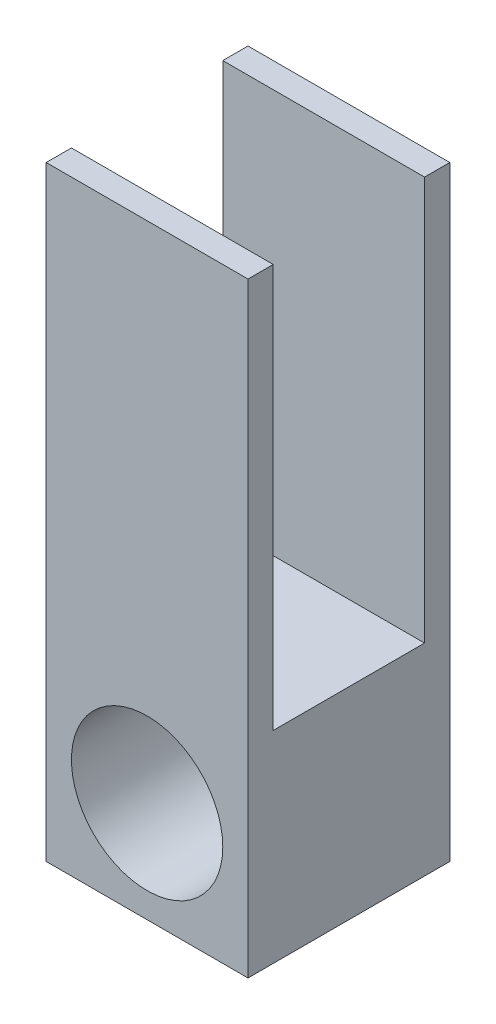
ISO-10303-21;
HEADER;
FILE_DESCRIPTION(('STEP AP214'),'2;1');
FILE_NAME('part.step','',(''),(''),'','','');
FILE_SCHEMA(('AUTOMOTIVE_DESIGN { 1 0 10303 214 1 1 1 1 }'));
ENDSEC;
DATA;
#1=APPLICATION_CONTEXT('core data for automotive mechanical design processes');
#2=APPLICATION_PROTOCOL_DEFINITION('international standard','automotive_design',2000,#1);
#3=PRODUCT_CONTEXT('',#1,'mechanical');
#4=PRODUCT('Part','Part','',(#3));
#5=PRODUCT_RELATED_PRODUCT_CATEGORY('part','',(#4));
#6=PRODUCT_DEFINITION_FORMATION('','',#4);
#7=PRODUCT_DEFINITION_CONTEXT('part definition',#1,'design');
#8=PRODUCT_DEFINITION('design','',#6,#7);
#9=PRODUCT_DEFINITION_SHAPE('','',#8);
#10=(LENGTH_UNIT() NAMED_UNIT(*) SI_UNIT(.MILLI.,.METRE.));
#11=(NAMED_UNIT(*) PLANE_ANGLE_UNIT() SI_UNIT($,.RADIAN.));
#12=(NAMED_UNIT(*) SI_UNIT($,.STERADIAN.) SOLID_ANGLE_UNIT());
#13=UNCERTAINTY_MEASURE_WITH_UNIT(LENGTH_MEASURE(1.E-05),#10,'distance_accuracy_value','');
#14=(GEOMETRIC_REPRESENTATION_CONTEXT(3) GLOBAL_UNCERTAINTY_ASSIGNED_CONTEXT((#13)) GLOBAL_UNIT_ASSIGNED_CONTEXT((#10,
#11,#12)) REPRESENTATION_CONTEXT('',''));
#15=CARTESIAN_POINT('',(0.,0.,0.));
#16=DIRECTION('',(0.,0.,1.));
#17=DIRECTION('',(1.,0.,0.));
#18=AXIS2_PLACEMENT_3D('',#15,#16,#17);
#19=CARTESIAN_POINT('',(-3.,9.,6.));
#20=DIRECTION('',(0.,-1.,0.));
#21=DIRECTION('',(0.,0.,-1.));
#22=AXIS2_PLACEMENT_3D('',#19,#20,#21);
#23=PLANE('',#22);
#24=DIRECTION('',(0.,0.,-1.));
#25=VECTOR('',#24,1.);
#26=CARTESIAN_POINT('',(-3.,9.,6.));
#27=LINE('',#26,#25);
#28=CARTESIAN_POINT('',(-3.,9.,0.75));
#29=VERTEX_POINT('',#28);
#30=CARTESIAN_POINT('',(-3.,9.,0.));
#31=VERTEX_POINT('',#30);
#32=EDGE_CURVE('E120',#29,#31,#27,.T.);
#33=ORIENTED_EDGE('',*,*,#32,.F.);
#34=DIRECTION('',(1.,0.,0.));
#35=VECTOR('',#34,1.);
#36=CARTESIAN_POINT('',(-3.,9.,0.75));
#37=LINE('',#36,#35);
#38=CARTESIAN_POINT('',(3.,9.,0.75));
#39=VERTEX_POINT('',#38);
#40=EDGE_CURVE('E107',#29,#39,#37,.T.);
#41=ORIENTED_EDGE('',*,*,#40,.T.);
#42=DIRECTION('',(0.,0.,-1.));
#43=VECTOR('',#42,1.);
#44=CARTESIAN_POINT('',(3.,9.,6.));
#45=LINE('',#44,#43);
#46=CARTESIAN_POINT('',(3.,9.,0.));
#47=VERTEX_POINT('',#46);
#48=EDGE_CURVE('E41',#39,#47,#45,.T.);
#49=ORIENTED_EDGE('',*,*,#48,.T.);
#50=DIRECTION('',(-1.,0.,0.));
#51=VECTOR('',#50,1.);
#52=CARTESIAN_POINT('',(-3.,9.,0.));
#53=LINE('',#52,#51);
#54=EDGE_CURVE('E127',#47,#31,#53,.T.);
#55=ORIENTED_EDGE('',*,*,#54,.T.);
#56=EDGE_LOOP('',(#33,#41,#49,#55));
#57=FACE_BOUND('',#56,.T.);
#58=ADVANCED_FACE('F33',(#57),#23,.F.);
#59=CARTESIAN_POINT('',(3.,-9.,6.));
#60=DIRECTION('',(-1.,0.,0.));
#61=DIRECTION('',(0.,0.,1.));
#62=AXIS2_PLACEMENT_3D('',#59,#60,#61);
#63=PLANE('',#62);
#64=ORIENTED_EDGE('',*,*,#48,.F.);
#65=DIRECTION('',(0.,1.,0.));
#66=VECTOR('',#65,1.);
#67=CARTESIAN_POINT('',(3.,-3.,0.75));
#68=LINE('',#67,#66);
#69=CARTESIAN_POINT('',(3.,-3.,0.75));
#70=VERTEX_POINT('',#69);
#71=EDGE_CURVE('E112',#70,#39,#68,.T.);
#72=ORIENTED_EDGE('',*,*,#71,.F.);
#73=DIRECTION('',(0.,0.,-1.));
#74=VECTOR('',#73,1.);
#75=CARTESIAN_POINT('',(3.,-3.,5.25));
#76=LINE('',#75,#74);
#77=CARTESIAN_POINT('',(3.,-3.,5.25));
#78=VERTEX_POINT('',#77);
#79=EDGE_CURVE('E124',#78,#70,#76,.T.);
#80=ORIENTED_EDGE('',*,*,#79,.F.);
#81=DIRECTION('',(0.,-1.,0.));
#82=VECTOR('',#81,1.);
#83=CARTESIAN_POINT('',(3.,-3.,5.25));
#84=LINE('',#83,#82);
#85=CARTESIAN_POINT('',(3.,9.,5.25));
#86=VERTEX_POINT('',#85);
#87=EDGE_CURVE('E162',#86,#78,#84,.T.);
#88=ORIENTED_EDGE('',*,*,#87,.F.);
#89=CARTESIAN_POINT('',(3.,9.,6.));
#90=VERTEX_POINT('',#89);
#91=EDGE_CURVE('E11',#90,#86,#45,.T.);
#92=ORIENTED_EDGE('',*,*,#91,.F.);
#93=DIRECTION('',(0.,1.,0.));
#94=VECTOR('',#93,1.);
#95=CARTESIAN_POINT('',(3.,-9.,6.));
#96=LINE('',#95,#94);
#97=CARTESIAN_POINT('',(3.,-9.,6.));
#98=VERTEX_POINT('',#97);
#99=EDGE_CURVE('E137',#98,#90,#96,.T.);
#100=ORIENTED_EDGE('',*,*,#99,.F.);
#101=DIRECTION('',(0.,0.,-1.));
#102=VECTOR('',#101,1.);
#103=CARTESIAN_POINT('',(3.,-9.,6.));
#104=LINE('',#103,#102);
#105=CARTESIAN_POINT('',(3.,-9.,0.));
#106=VERTEX_POINT('',#105);
#107=EDGE_CURVE('E132',#98,#106,#104,.T.);
#108=ORIENTED_EDGE('',*,*,#107,.T.);
#109=DIRECTION('',(0.,1.,0.));
#110=VECTOR('',#109,1.);
#111=CARTESIAN_POINT('',(3.,-9.,0.));
#112=LINE('',#111,#110);
#113=EDGE_CURVE('E141',#106,#47,#112,.T.);
#114=ORIENTED_EDGE('',*,*,#113,.T.);
#115=EDGE_LOOP('',(#64,#72,#80,#88,#92,#100,#108,#114));
#116=FACE_BOUND('',#115,.T.);
#117=ADVANCED_FACE('F35',(#116),#63,.F.);
#118=ORIENTED_EDGE('',*,*,#91,.T.);
#119=DIRECTION('',(1.,0.,0.));
#120=VECTOR('',#119,1.);
#121=CARTESIAN_POINT('',(-3.,9.,5.25));
#122=LINE('',#121,#120);
#123=CARTESIAN_POINT('',(-3.,9.,5.25));
#124=VERTEX_POINT('',#123);
#125=EDGE_CURVE('E116',#124,#86,#122,.T.);
#126=ORIENTED_EDGE('',*,*,#125,.F.);
#127=CARTESIAN_POINT('',(-3.,9.,6.));
#128=VERTEX_POINT('',#127);
#129=EDGE_CURVE('E129',#128,#124,#27,.T.);
#130=ORIENTED_EDGE('',*,*,#129,.F.);
#131=DIRECTION('',(-1.,0.,0.));
#132=VECTOR('',#131,1.);
#133=CARTESIAN_POINT('',(-3.,9.,6.));
#134=LINE('',#133,#132);
#135=EDGE_CURVE('E85',#90,#128,#134,.T.);
#136=ORIENTED_EDGE('',*,*,#135,.F.);
#137=EDGE_LOOP('',(#118,#126,#130,#136));
#138=FACE_BOUND('',#137,.T.);
#139=ADVANCED_FACE('F172',(#138),#23,.F.);
#140=CARTESIAN_POINT('',(-3.,-9.,6.));
#141=DIRECTION('',(1.,0.,0.));
#142=DIRECTION('',(0.,0.,-1.));
#143=AXIS2_PLACEMENT_3D('',#140,#141,#142);
#144=PLANE('',#143);
#145=DIRECTION('',(0.,0.,-1.));
#146=VECTOR('',#145,1.);
#147=CARTESIAN_POINT('',(-3.,-3.,5.25));
#148=LINE('',#147,#146);
#149=CARTESIAN_POINT('',(-3.,-3.,5.25));
#150=VERTEX_POINT('',#149);
#151=CARTESIAN_POINT('',(-3.,-3.,0.75));
#152=VERTEX_POINT('',#151);
#153=EDGE_CURVE('E48',#150,#152,#148,.T.);
#154=ORIENTED_EDGE('',*,*,#153,.T.);
#155=DIRECTION('',(0.,1.,0.));
#156=VECTOR('',#155,1.);
#157=CARTESIAN_POINT('',(-3.,-3.,0.75));
#158=LINE('',#157,#156);
#159=EDGE_CURVE('E110',#152,#29,#158,.T.);
#160=ORIENTED_EDGE('',*,*,#159,.T.);
#161=ORIENTED_EDGE('',*,*,#32,.T.);
#162=DIRECTION('',(0.,-1.,0.));
#163=VECTOR('',#162,1.);
#164=CARTESIAN_POINT('',(-3.,-9.,0.));
#165=LINE('',#164,#163);
#166=CARTESIAN_POINT('',(-3.,-9.,0.));
#167=VERTEX_POINT('',#166);
#168=EDGE_CURVE('E138',#31,#167,#165,.T.);
#169=ORIENTED_EDGE('',*,*,#168,.T.);
#170=DIRECTION('',(0.,0.,-1.));
#171=VECTOR('',#170,1.);
#172=CARTESIAN_POINT('',(-3.,-9.,6.));
#173=LINE('',#172,#171);
#174=CARTESIAN_POINT('',(-3.,-9.,6.));
#175=VERTEX_POINT('',#174);
#176=EDGE_CURVE('E130',#175,#167,#173,.T.);
#177=ORIENTED_EDGE('',*,*,#176,.F.);
#178=DIRECTION('',(0.,-1.,0.));
#179=VECTOR('',#178,1.);
#180=CARTESIAN_POINT('',(-3.,-9.,6.));
#181=LINE('',#180,#179);
#182=EDGE_CURVE('E146',#128,#175,#181,.T.);
#183=ORIENTED_EDGE('',*,*,#182,.F.);
#184=ORIENTED_EDGE('',*,*,#129,.T.);
#185=DIRECTION('',(0.,-1.,0.));
#186=VECTOR('',#185,1.);
#187=CARTESIAN_POINT('',(-3.,-3.,5.25));
#188=LINE('',#187,#186);
#189=EDGE_CURVE('E123',#124,#150,#188,.T.);
#190=ORIENTED_EDGE('',*,*,#189,.T.);
#191=EDGE_LOOP('',(#154,#160,#161,#169,#177,#183,#184,#190));
#192=FACE_BOUND('',#191,.T.);
#193=ADVANCED_FACE('F119',(#192),#144,.F.);
#194=CARTESIAN_POINT('',(-3.,-9.,6.));
#195=DIRECTION('',(0.,1.,0.));
#196=DIRECTION('',(0.,0.,1.));
#197=AXIS2_PLACEMENT_3D('',#194,#195,#196);
#198=PLANE('',#197);
#199=DIRECTION('',(1.,0.,0.));
#200=VECTOR('',#199,1.);
#201=CARTESIAN_POINT('',(-3.,-9.,0.));
#202=LINE('',#201,#200);
#203=EDGE_CURVE('E78',#167,#106,#202,.T.);
#204=ORIENTED_EDGE('',*,*,#203,.T.);
#205=ORIENTED_EDGE('',*,*,#107,.F.);
#206=DIRECTION('',(1.,0.,0.));
#207=VECTOR('',#206,1.);
#208=CARTESIAN_POINT('',(-3.,-9.,6.));
#209=LINE('',#208,#207);
#210=EDGE_CURVE('E57',#175,#98,#209,.T.);
#211=ORIENTED_EDGE('',*,*,#210,.F.);
#212=ORIENTED_EDGE('',*,*,#176,.T.);
#213=EDGE_LOOP('',(#204,#205,#211,#212));
#214=FACE_BOUND('',#213,.T.);
#215=ADVANCED_FACE('F196',(#214),#198,.F.);
#216=CARTESIAN_POINT('',(0.,0.,6.));
#217=DIRECTION('',(0.,0.,-1.));
#218=DIRECTION('',(-1.,0.,0.));
#219=AXIS2_PLACEMENT_3D('',#216,#217,#218);
#220=PLANE('',#219);
#221=CARTESIAN_POINT('',(0.,-6.,6.));
#222=DIRECTION('',(0.,0.,1.));
#223=DIRECTION('',(1.,0.,0.));
#224=AXIS2_PLACEMENT_3D('',#221,#222,#223);
#225=CIRCLE('',#224,2.25);
#226=CARTESIAN_POINT('',(2.25,-6.,6.));
#227=VERTEX_POINT('',#226);
#228=EDGE_CURVE('E150',#227,#227,#225,.T.);
#229=ORIENTED_EDGE('',*,*,#228,.F.);
#230=EDGE_LOOP('',(#229));
#231=FACE_BOUND('',#230,.T.);
#232=ORIENTED_EDGE('',*,*,#99,.T.);
#233=ORIENTED_EDGE('',*,*,#135,.T.);
#234=ORIENTED_EDGE('',*,*,#182,.T.);
#235=ORIENTED_EDGE('',*,*,#210,.T.);
#236=EDGE_LOOP('',(#232,#233,#234,#235));
#237=FACE_BOUND('',#236,.T.);
#238=ADVANCED_FACE('F200',(#231,#237),#220,.F.);
#239=CARTESIAN_POINT('',(0.,0.,0.));
#240=DIRECTION('',(0.,0.,-1.));
#241=DIRECTION('',(-1.,0.,0.));
#242=AXIS2_PLACEMENT_3D('',#239,#240,#241);
#243=PLANE('',#242);
#244=CARTESIAN_POINT('',(0.,-6.,0.));
#245=DIRECTION('',(0.,0.,1.));
#246=DIRECTION('',(1.,0.,0.));
#247=AXIS2_PLACEMENT_3D('',#244,#245,#246);
#248=CIRCLE('',#247,2.25);
#249=CARTESIAN_POINT('',(2.25,-6.,0.));
#250=VERTEX_POINT('',#249);
#251=EDGE_CURVE('E144',#250,#250,#248,.T.);
#252=ORIENTED_EDGE('',*,*,#251,.T.);
#253=EDGE_LOOP('',(#252));
#254=FACE_BOUND('',#253,.T.);
#255=ORIENTED_EDGE('',*,*,#113,.F.);
#256=ORIENTED_EDGE('',*,*,#203,.F.);
#257=ORIENTED_EDGE('',*,*,#168,.F.);
#258=ORIENTED_EDGE('',*,*,#54,.F.);
#259=EDGE_LOOP('',(#255,#256,#257,#258));
#260=FACE_BOUND('',#259,.T.);
#261=ADVANCED_FACE('F203',(#254,#260),#243,.T.);
#262=CARTESIAN_POINT('',(0.,-6.,0.));
#263=DIRECTION('',(0.,0.,1.));
#264=DIRECTION('',(1.,0.,0.));
#265=AXIS2_PLACEMENT_3D('',#262,#263,#264);
#266=CYLINDRICAL_SURFACE('',#265,2.25);
#267=ORIENTED_EDGE('',*,*,#251,.F.);
#268=EDGE_LOOP('',(#267));
#269=FACE_BOUND('',#268,.T.);
#270=ORIENTED_EDGE('',*,*,#228,.T.);
#271=EDGE_LOOP('',(#270));
#272=FACE_BOUND('',#271,.T.);
#273=ADVANCED_FACE('F185',(#269,#272),#266,.F.);
#274=CARTESIAN_POINT('',(-3.,-3.,0.75));
#275=DIRECTION('',(0.,0.,-1.));
#276=DIRECTION('',(0.,1.,0.));
#277=AXIS2_PLACEMENT_3D('',#274,#275,#276);
#278=PLANE('',#277);
#279=ORIENTED_EDGE('',*,*,#71,.T.);
#280=ORIENTED_EDGE('',*,*,#40,.F.);
#281=ORIENTED_EDGE('',*,*,#159,.F.);
#282=DIRECTION('',(1.,0.,0.));
#283=VECTOR('',#282,1.);
#284=CARTESIAN_POINT('',(-3.,-3.,0.75));
#285=LINE('',#284,#283);
#286=EDGE_CURVE('E153',#152,#70,#285,.T.);
#287=ORIENTED_EDGE('',*,*,#286,.T.);
#288=EDGE_LOOP('',(#279,#280,#281,#287));
#289=FACE_BOUND('',#288,.T.);
#290=ADVANCED_FACE('F109',(#289),#278,.F.);
#291=CARTESIAN_POINT('',(-3.,-3.,5.25));
#292=DIRECTION('',(0.,-1.,0.));
#293=DIRECTION('',(0.,0.,-1.));
#294=AXIS2_PLACEMENT_3D('',#291,#292,#293);
#295=PLANE('',#294);
#296=ORIENTED_EDGE('',*,*,#79,.T.);
#297=ORIENTED_EDGE('',*,*,#286,.F.);
#298=ORIENTED_EDGE('',*,*,#153,.F.);
#299=DIRECTION('',(1.,0.,0.));
#300=VECTOR('',#299,1.);
#301=CARTESIAN_POINT('',(-3.,-3.,5.25));
#302=LINE('',#301,#300);
#303=EDGE_CURVE('E157',#150,#78,#302,.T.);
#304=ORIENTED_EDGE('',*,*,#303,.T.);
#305=EDGE_LOOP('',(#296,#297,#298,#304));
#306=FACE_BOUND('',#305,.T.);
#307=ADVANCED_FACE('F177',(#306),#295,.F.);
#308=CARTESIAN_POINT('',(-3.,-3.,5.25));
#309=DIRECTION('',(0.,0.,1.));
#310=DIRECTION('',(1.,0.,0.));
#311=AXIS2_PLACEMENT_3D('',#308,#309,#310);
#312=PLANE('',#311);
#313=ORIENTED_EDGE('',*,*,#87,.T.);
#314=ORIENTED_EDGE('',*,*,#303,.F.);
#315=ORIENTED_EDGE('',*,*,#189,.F.);
#316=ORIENTED_EDGE('',*,*,#125,.T.);
#317=EDGE_LOOP('',(#313,#314,#315,#316));
#318=FACE_BOUND('',#317,.T.);
#319=ADVANCED_FACE('F170',(#318),#312,.F.);
#320=CLOSED_SHELL('',(#58,#117,#139,#193,#215,#238,#261,#273,#290,#307,#319));
#321=MANIFOLD_SOLID_BREP('B2',#320);
#322=ADVANCED_BREP_SHAPE_REPRESENTATION('',(#18,#321),#14);
#323=SHAPE_DEFINITION_REPRESENTATION(#9,#322);
ENDSEC;
END-ISO-10303-21;
